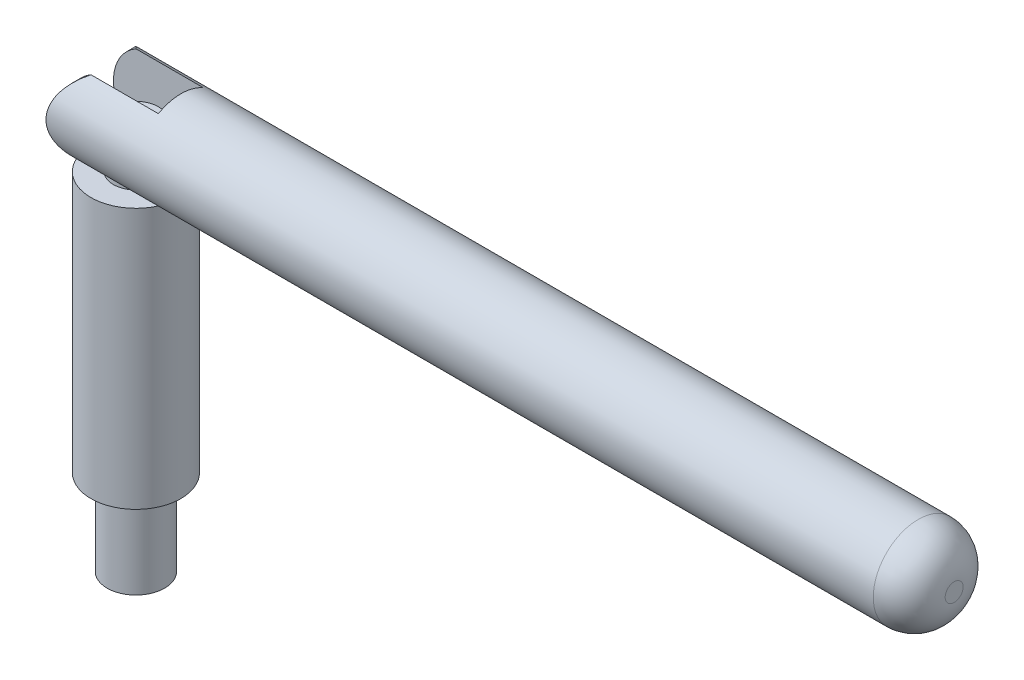
ISO-10303-21;
HEADER;
FILE_DESCRIPTION(('STEP AP214'),'2;1');
FILE_NAME('part.step','',(''),(''),'','','');
FILE_SCHEMA(('AUTOMOTIVE_DESIGN { 1 0 10303 214 1 1 1 1 }'));
ENDSEC;
DATA;
#1=APPLICATION_CONTEXT('core data for automotive mechanical design processes');
#2=APPLICATION_PROTOCOL_DEFINITION('international standard','automotive_design',2000,#1);
#3=PRODUCT_CONTEXT('',#1,'mechanical');
#4=PRODUCT('Part','Part','',(#3));
#5=PRODUCT_RELATED_PRODUCT_CATEGORY('part','',(#4));
#6=PRODUCT_DEFINITION_FORMATION('','',#4);
#7=PRODUCT_DEFINITION_CONTEXT('part definition',#1,'design');
#8=PRODUCT_DEFINITION('design','',#6,#7);
#9=PRODUCT_DEFINITION_SHAPE('','',#8);
#10=(LENGTH_UNIT() NAMED_UNIT(*) SI_UNIT(.MILLI.,.METRE.));
#11=(NAMED_UNIT(*) PLANE_ANGLE_UNIT() SI_UNIT($,.RADIAN.));
#12=(NAMED_UNIT(*) SI_UNIT($,.STERADIAN.) SOLID_ANGLE_UNIT());
#13=UNCERTAINTY_MEASURE_WITH_UNIT(LENGTH_MEASURE(1.E-05),#10,'distance_accuracy_value','');
#14=(GEOMETRIC_REPRESENTATION_CONTEXT(3) GLOBAL_UNCERTAINTY_ASSIGNED_CONTEXT((#13)) GLOBAL_UNIT_ASSIGNED_CONTEXT((#10,
#11,#12)) REPRESENTATION_CONTEXT('',''));
#15=CARTESIAN_POINT('',(0.,0.,0.));
#16=DIRECTION('',(0.,0.,1.));
#17=DIRECTION('',(1.,0.,0.));
#18=AXIS2_PLACEMENT_3D('',#15,#16,#17);
#19=CARTESIAN_POINT('',(-5.,34.,0.));
#20=DIRECTION('',(1.,0.,0.));
#21=DIRECTION('',(0.,0.,-1.));
#22=AXIS2_PLACEMENT_3D('',#19,#20,#21);
#23=CYLINDRICAL_SURFACE('',#22,5.);
#24=CARTESIAN_POINT('',(87.,34.,0.));
#25=DIRECTION('',(1.,0.,0.));
#26=DIRECTION('',(0.,0.,-1.));
#27=AXIS2_PLACEMENT_3D('',#24,#25,#26);
#28=CIRCLE('',#27,5.);
#29=CARTESIAN_POINT('',(87.,34.,-5.));
#30=VERTEX_POINT('',#29);
#31=EDGE_CURVE('E110',#30,#30,#28,.F.);
#32=ORIENTED_EDGE('',*,*,#31,.T.);
#33=EDGE_LOOP('',(#32));
#34=FACE_BOUND('',#33,.T.);
#35=DIRECTION('',(1.,0.,0.));
#36=VECTOR('',#35,1.);
#37=CARTESIAN_POINT('',(-5.,38.3301270189222,2.5));
#38=LINE('',#37,#36);
#39=CARTESIAN_POINT('',(5.,38.3301270189222,2.5));
#40=VERTEX_POINT('',#39);
#41=CARTESIAN_POINT('',(-2.5,38.3301270189222,2.5));
#42=VERTEX_POINT('',#41);
#43=EDGE_CURVE('E105',#40,#42,#38,.F.);
#44=ORIENTED_EDGE('',*,*,#43,.T.);
#45=CARTESIAN_POINT('',(0.,34.,0.));
#46=DIRECTION('',(0.707106781186547,0.,0.707106781186547));
#47=DIRECTION('',(0.707106781186547,0.,-0.707106781186547));
#48=AXIS2_PLACEMENT_3D('',#45,#46,#47);
#49=ELLIPSE('',#48,7.07106781186548,5.);
#50=CARTESIAN_POINT('',(-2.5,29.6698729810778,2.5));
#51=VERTEX_POINT('',#50);
#52=EDGE_CURVE('E120',#42,#51,#49,.T.);
#53=ORIENTED_EDGE('',*,*,#52,.T.);
#54=DIRECTION('',(1.,0.,0.));
#55=VECTOR('',#54,1.);
#56=CARTESIAN_POINT('',(-5.,29.6698729810778,2.5));
#57=LINE('',#56,#55);
#58=CARTESIAN_POINT('',(5.,29.6698729810778,2.5));
#59=VERTEX_POINT('',#58);
#60=EDGE_CURVE('E64',#51,#59,#57,.T.);
#61=ORIENTED_EDGE('',*,*,#60,.T.);
#62=CARTESIAN_POINT('',(5.,34.,0.));
#63=DIRECTION('',(-1.,0.,0.));
#64=DIRECTION('',(0.,0.,1.));
#65=AXIS2_PLACEMENT_3D('',#62,#63,#64);
#66=CIRCLE('',#65,5.);
#67=CARTESIAN_POINT('',(5.,29.6698729810778,-2.5));
#68=VERTEX_POINT('',#67);
#69=EDGE_CURVE('E112',#59,#68,#66,.F.);
#70=ORIENTED_EDGE('',*,*,#69,.T.);
#71=DIRECTION('',(1.,0.,0.));
#72=VECTOR('',#71,1.);
#73=CARTESIAN_POINT('',(-5.,29.6698729810778,-2.5));
#74=LINE('',#73,#72);
#75=CARTESIAN_POINT('',(-2.5,29.6698729810778,-2.5));
#76=VERTEX_POINT('',#75);
#77=EDGE_CURVE('E88',#68,#76,#74,.F.);
#78=ORIENTED_EDGE('',*,*,#77,.T.);
#79=CARTESIAN_POINT('',(0.,34.,0.));
#80=DIRECTION('',(0.707106781186547,0.,-0.707106781186547));
#81=DIRECTION('',(0.707106781186547,0.,0.707106781186547));
#82=AXIS2_PLACEMENT_3D('',#79,#80,#81);
#83=ELLIPSE('',#82,7.07106781186548,5.);
#84=CARTESIAN_POINT('',(-2.5,38.3301270189222,-2.5));
#85=VERTEX_POINT('',#84);
#86=EDGE_CURVE('E57',#76,#85,#83,.T.);
#87=ORIENTED_EDGE('',*,*,#86,.T.);
#88=DIRECTION('',(1.,0.,0.));
#89=VECTOR('',#88,1.);
#90=CARTESIAN_POINT('',(-5.,38.3301270189222,-2.5));
#91=LINE('',#90,#89);
#92=CARTESIAN_POINT('',(5.,38.3301270189222,-2.5));
#93=VERTEX_POINT('',#92);
#94=EDGE_CURVE('E86',#85,#93,#91,.T.);
#95=ORIENTED_EDGE('',*,*,#94,.T.);
#96=EDGE_CURVE('E51',#93,#40,#66,.F.);
#97=ORIENTED_EDGE('',*,*,#96,.T.);
#98=EDGE_LOOP('',(#44,#53,#61,#70,#78,#87,#95,#97));
#99=FACE_BOUND('',#98,.T.);
#100=ADVANCED_FACE('F43',(#34,#99),#23,.T.);
#101=CARTESIAN_POINT('',(5.,39.,2.5));
#102=DIRECTION('',(0.,0.,-1.));
#103=DIRECTION('',(-1.,0.,0.));
#104=AXIS2_PLACEMENT_3D('',#101,#102,#103);
#105=PLANE('',#104);
#106=CARTESIAN_POINT('',(0.,34.,2.5));
#107=DIRECTION('',(0.,0.,-1.));
#108=DIRECTION('',(-1.,0.,0.));
#109=AXIS2_PLACEMENT_3D('',#106,#107,#108);
#110=CIRCLE('',#109,5.);
#111=EDGE_CURVE('E89',#51,#42,#110,.T.);
#112=ORIENTED_EDGE('',*,*,#111,.T.);
#113=ORIENTED_EDGE('',*,*,#43,.F.);
#114=DIRECTION('',(0.,-1.,0.));
#115=VECTOR('',#114,1.);
#116=CARTESIAN_POINT('',(5.,39.,2.5));
#117=LINE('',#116,#115);
#118=EDGE_CURVE('E97',#40,#59,#117,.T.);
#119=ORIENTED_EDGE('',*,*,#118,.T.);
#120=ORIENTED_EDGE('',*,*,#60,.F.);
#121=EDGE_LOOP('',(#112,#113,#119,#120));
#122=FACE_BOUND('',#121,.T.);
#123=ADVANCED_FACE('F117',(#122),#105,.T.);
#124=CARTESIAN_POINT('',(5.,39.,-2.5));
#125=DIRECTION('',(0.,0.,1.));
#126=DIRECTION('',(1.,0.,0.));
#127=AXIS2_PLACEMENT_3D('',#124,#125,#126);
#128=PLANE('',#127);
#129=ORIENTED_EDGE('',*,*,#94,.F.);
#130=CARTESIAN_POINT('',(0.,34.,-2.5));
#131=DIRECTION('',(0.,0.,1.));
#132=DIRECTION('',(1.,0.,0.));
#133=AXIS2_PLACEMENT_3D('',#130,#131,#132);
#134=CIRCLE('',#133,5.);
#135=EDGE_CURVE('E13',#85,#76,#134,.T.);
#136=ORIENTED_EDGE('',*,*,#135,.T.);
#137=ORIENTED_EDGE('',*,*,#77,.F.);
#138=DIRECTION('',(0.,-1.,0.));
#139=VECTOR('',#138,1.);
#140=CARTESIAN_POINT('',(5.,39.,-2.5));
#141=LINE('',#140,#139);
#142=EDGE_CURVE('E96',#93,#68,#141,.T.);
#143=ORIENTED_EDGE('',*,*,#142,.F.);
#144=EDGE_LOOP('',(#129,#136,#137,#143));
#145=FACE_BOUND('',#144,.T.);
#146=ADVANCED_FACE('F94',(#145),#128,.T.);
#147=CARTESIAN_POINT('',(91.,34.,0.));
#148=DIRECTION('',(1.,0.,0.));
#149=DIRECTION('',(0.,0.,-1.));
#150=AXIS2_PLACEMENT_3D('',#147,#148,#149);
#151=PLANE('',#150);
#152=CARTESIAN_POINT('',(91.,34.,0.));
#153=DIRECTION('',(1.,0.,0.));
#154=DIRECTION('',(0.,0.,-1.));
#155=AXIS2_PLACEMENT_3D('',#152,#153,#154);
#156=CIRCLE('',#155,1.);
#157=CARTESIAN_POINT('',(91.,34.,-1.));
#158=VERTEX_POINT('',#157);
#159=EDGE_CURVE('E107',#158,#158,#156,.T.);
#160=ORIENTED_EDGE('',*,*,#159,.T.);
#161=EDGE_LOOP('',(#160));
#162=FACE_BOUND('',#161,.T.);
#163=ADVANCED_FACE('F137',(#162),#151,.T.);
#164=CARTESIAN_POINT('',(87.,34.,0.));
#165=DIRECTION('',(1.,0.,0.));
#166=DIRECTION('',(0.,0.,-1.));
#167=AXIS2_PLACEMENT_3D('',#164,#165,#166);
#168=DEGENERATE_TOROIDAL_SURFACE('',#167,1.,4.,.T.);
#169=ORIENTED_EDGE('',*,*,#31,.F.);
#170=EDGE_LOOP('',(#169));
#171=FACE_BOUND('',#170,.T.);
#172=ORIENTED_EDGE('',*,*,#159,.F.);
#173=EDGE_LOOP('',(#172));
#174=FACE_BOUND('',#173,.T.);
#175=ADVANCED_FACE('F45',(#171,#174),#168,.T.);
#176=CARTESIAN_POINT('',(5.,39.,-2.5));
#177=DIRECTION('',(-1.,0.,0.));
#178=DIRECTION('',(0.,0.,1.));
#179=AXIS2_PLACEMENT_3D('',#176,#177,#178);
#180=PLANE('',#179);
#181=ORIENTED_EDGE('',*,*,#118,.F.);
#182=ORIENTED_EDGE('',*,*,#96,.F.);
#183=ORIENTED_EDGE('',*,*,#142,.T.);
#184=ORIENTED_EDGE('',*,*,#69,.F.);
#185=EDGE_LOOP('',(#181,#182,#183,#184));
#186=FACE_BOUND('',#185,.T.);
#187=ADVANCED_FACE('F115',(#186),#180,.T.);
#188=CARTESIAN_POINT('',(0.,34.,-5.));
#189=DIRECTION('',(0.,0.,1.));
#190=DIRECTION('',(1.,0.,0.));
#191=AXIS2_PLACEMENT_3D('',#188,#189,#190);
#192=CYLINDRICAL_SURFACE('',#191,5.);
#193=ORIENTED_EDGE('',*,*,#135,.F.);
#194=ORIENTED_EDGE('',*,*,#86,.F.);
#195=EDGE_LOOP('',(#193,#194));
#196=FACE_BOUND('',#195,.T.);
#197=ADVANCED_FACE('F91',(#196),#192,.T.);
#198=ORIENTED_EDGE('',*,*,#52,.F.);
#199=ORIENTED_EDGE('',*,*,#111,.F.);
#200=EDGE_LOOP('',(#198,#199));
#201=FACE_BOUND('',#200,.T.);
#202=ADVANCED_FACE('F122',(#201),#192,.T.);
#203=CLOSED_SHELL('',(#100,#123,#146,#163,#175,#187,#197,#202));
#204=MANIFOLD_SOLID_BREP('B2',#203);
#205=CARTESIAN_POINT('',(0.,0.,0.));
#206=DIRECTION('',(0.,1.,0.));
#207=DIRECTION('',(0.,0.,1.));
#208=AXIS2_PLACEMENT_3D('',#205,#206,#207);
#209=PLANE('',#208);
#210=CARTESIAN_POINT('',(0.,0.,0.));
#211=DIRECTION('',(0.,1.,0.));
#212=DIRECTION('',(0.,0.,1.));
#213=AXIS2_PLACEMENT_3D('',#210,#211,#212);
#214=CIRCLE('',#213,5.);
#215=CARTESIAN_POINT('',(0.,0.,-5.));
#216=VERTEX_POINT('',#215);
#217=EDGE_CURVE('E211',#216,#216,#214,.T.);
#218=ORIENTED_EDGE('',*,*,#217,.F.);
#219=EDGE_LOOP('',(#218));
#220=FACE_BOUND('',#219,.T.);
#221=CARTESIAN_POINT('',(0.,0.,0.));
#222=DIRECTION('',(0.,1.,0.));
#223=DIRECTION('',(0.,0.,1.));
#224=AXIS2_PLACEMENT_3D('',#221,#222,#223);
#225=CIRCLE('',#224,3.2);
#226=CARTESIAN_POINT('',(0.,0.,3.2));
#227=VERTEX_POINT('',#226);
#228=EDGE_CURVE('E42',#227,#227,#225,.F.);
#229=ORIENTED_EDGE('',*,*,#228,.F.);
#230=EDGE_LOOP('',(#229));
#231=FACE_BOUND('',#230,.T.);
#232=ADVANCED_FACE('F200',(#220,#231),#209,.F.);
#233=CARTESIAN_POINT('',(0.,29.,0.));
#234=DIRECTION('',(0.,1.,0.));
#235=DIRECTION('',(0.,0.,1.));
#236=AXIS2_PLACEMENT_3D('',#233,#234,#235);
#237=PLANE('',#236);
#238=CARTESIAN_POINT('',(0.,29.,0.));
#239=DIRECTION('',(0.,1.,0.));
#240=DIRECTION('',(0.,0.,1.));
#241=AXIS2_PLACEMENT_3D('',#238,#239,#240);
#242=CIRCLE('',#241,5.);
#243=CARTESIAN_POINT('',(0.,29.,-5.));
#244=VERTEX_POINT('',#243);
#245=EDGE_CURVE('E207',#244,#244,#242,.T.);
#246=ORIENTED_EDGE('',*,*,#245,.T.);
#247=EDGE_LOOP('',(#246));
#248=FACE_BOUND('',#247,.T.);
#249=CARTESIAN_POINT('',(0.,29.,0.));
#250=DIRECTION('',(0.,1.,0.));
#251=DIRECTION('',(0.,0.,1.));
#252=AXIS2_PLACEMENT_3D('',#249,#250,#251);
#253=CIRCLE('',#252,2.5);
#254=CARTESIAN_POINT('',(0.,29.,2.5));
#255=VERTEX_POINT('',#254);
#256=EDGE_CURVE('E218',#255,#255,#253,.T.);
#257=ORIENTED_EDGE('',*,*,#256,.F.);
#258=EDGE_LOOP('',(#257));
#259=FACE_BOUND('',#258,.T.);
#260=ADVANCED_FACE('F242',(#248,#259),#237,.T.);
#261=CARTESIAN_POINT('',(0.,29.,0.));
#262=DIRECTION('',(0.,-1.,0.));
#263=DIRECTION('',(0.,0.,-1.));
#264=AXIS2_PLACEMENT_3D('',#261,#262,#263);
#265=CYLINDRICAL_SURFACE('',#264,5.);
#266=CARTESIAN_POINT('',(0.,29.,-5.));
#267=CARTESIAN_POINT('',(0.,28.6979166666667,-5.));
#268=CARTESIAN_POINT('',(0.,28.3958333333333,-5.));
#269=CARTESIAN_POINT('',(0.,27.7916666666667,-5.));
#270=CARTESIAN_POINT('',(0.,27.4895833333333,-5.));
#271=CARTESIAN_POINT('',(0.,26.8854166666667,-5.));
#272=CARTESIAN_POINT('',(0.,26.5833333333333,-5.));
#273=CARTESIAN_POINT('',(0.,25.9791666666667,-5.));
#274=CARTESIAN_POINT('',(0.,25.6770833333333,-5.));
#275=CARTESIAN_POINT('',(0.,25.0729166666667,-5.));
#276=CARTESIAN_POINT('',(0.,24.7708333333333,-5.));
#277=CARTESIAN_POINT('',(0.,24.1666666666667,-5.));
#278=CARTESIAN_POINT('',(0.,23.8645833333333,-5.));
#279=CARTESIAN_POINT('',(0.,23.2604166666667,-5.));
#280=CARTESIAN_POINT('',(0.,22.9583333333333,-5.));
#281=CARTESIAN_POINT('',(0.,22.3541666666667,-5.));
#282=CARTESIAN_POINT('',(0.,22.0520833333333,-5.));
#283=CARTESIAN_POINT('',(0.,21.4479166666667,-5.));
#284=CARTESIAN_POINT('',(0.,21.1458333333333,-5.));
#285=CARTESIAN_POINT('',(0.,20.5416666666667,-5.));
#286=CARTESIAN_POINT('',(0.,20.2395833333333,-5.));
#287=CARTESIAN_POINT('',(0.,19.6354166666667,-5.));
#288=CARTESIAN_POINT('',(0.,19.3333333333333,-5.));
#289=CARTESIAN_POINT('',(0.,18.7291666666667,-5.));
#290=CARTESIAN_POINT('',(0.,18.4270833333333,-5.));
#291=CARTESIAN_POINT('',(0.,17.8229166666667,-5.));
#292=CARTESIAN_POINT('',(0.,17.5208333333333,-5.));
#293=CARTESIAN_POINT('',(0.,16.9166666666667,-5.));
#294=CARTESIAN_POINT('',(0.,16.6145833333333,-5.));
#295=CARTESIAN_POINT('',(0.,16.0104166666667,-5.));
#296=CARTESIAN_POINT('',(0.,15.7083333333333,-5.));
#297=CARTESIAN_POINT('',(0.,15.1041666666667,-5.));
#298=CARTESIAN_POINT('',(0.,14.8020833333333,-5.));
#299=CARTESIAN_POINT('',(0.,14.1979166666667,-5.));
#300=CARTESIAN_POINT('',(0.,13.8958333333333,-5.));
#301=CARTESIAN_POINT('',(0.,13.2916666666667,-5.));
#302=CARTESIAN_POINT('',(0.,12.9895833333333,-5.));
#303=CARTESIAN_POINT('',(0.,12.3854166666667,-5.));
#304=CARTESIAN_POINT('',(0.,12.0833333333333,-5.));
#305=CARTESIAN_POINT('',(0.,11.4791666666667,-5.));
#306=CARTESIAN_POINT('',(0.,11.1770833333333,-5.));
#307=CARTESIAN_POINT('',(0.,10.5729166666667,-5.));
#308=CARTESIAN_POINT('',(0.,10.2708333333333,-5.));
#309=CARTESIAN_POINT('',(0.,9.66666666666667,-5.));
#310=CARTESIAN_POINT('',(0.,9.36458333333333,-5.));
#311=CARTESIAN_POINT('',(0.,8.76041666666667,-5.));
#312=CARTESIAN_POINT('',(0.,8.45833333333333,-5.));
#313=CARTESIAN_POINT('',(0.,7.85416666666667,-5.));
#314=CARTESIAN_POINT('',(0.,7.55208333333333,-5.));
#315=CARTESIAN_POINT('',(0.,6.94791666666667,-5.));
#316=CARTESIAN_POINT('',(0.,6.64583333333333,-5.));
#317=CARTESIAN_POINT('',(0.,6.04166666666667,-5.));
#318=CARTESIAN_POINT('',(0.,5.73958333333333,-5.));
#319=CARTESIAN_POINT('',(0.,5.13541666666667,-5.));
#320=CARTESIAN_POINT('',(0.,4.83333333333333,-5.));
#321=CARTESIAN_POINT('',(0.,4.22916666666667,-5.));
#322=CARTESIAN_POINT('',(0.,3.92708333333333,-5.));
#323=CARTESIAN_POINT('',(0.,3.32291666666667,-5.));
#324=CARTESIAN_POINT('',(0.,3.02083333333333,-5.));
#325=CARTESIAN_POINT('',(0.,2.41666666666667,-5.));
#326=CARTESIAN_POINT('',(0.,2.11458333333333,-5.));
#327=CARTESIAN_POINT('',(0.,1.51041666666667,-5.));
#328=CARTESIAN_POINT('',(0.,1.20833333333333,-5.));
#329=CARTESIAN_POINT('',(0.,0.604166666666667,-5.));
#330=CARTESIAN_POINT('',(0.,0.302083333333333,-5.));
#331=CARTESIAN_POINT('',(0.,0.,-5.));
#332=B_SPLINE_CURVE_WITH_KNOTS('',3,(#266,#267,#268,#269,#270,#271,#272,#273,#274,#275,#276,
#277,#278,#279,#280,#281,#282,#283,#284,#285,#286,#287,#288,#289,#290,#291,#292,#293,#294,#295,
#296,#297,#298,#299,#300,#301,#302,#303,#304,#305,#306,#307,#308,#309,#310,#311,#312,#313,#314,
#315,#316,#317,#318,#319,#320,#321,#322,#323,#324,#325,#326,#327,#328,#329,#330,#331),
.UNSPECIFIED.,.F.,.F.,(4,2,2,2,2,2,2,2,2,2,2,2,2,2,2,2,2,2,2,2,2,2,2,2,2,2,2,2,2,2,2,2,4),(0.,
0.906249999999997,1.8125,2.71875,3.625,4.53125,5.4375,6.34375,7.25,8.15625,9.0625,9.96875,
10.875,11.78125,12.6875,13.59375,14.5,15.40625,16.3125,17.21875,18.125,19.03125,19.9375,
20.84375,21.75,22.65625,23.5625,24.46875,25.375,26.28125,27.1875,28.09375,29.),.UNSPECIFIED.);
#333=EDGE_CURVE('BSEAM202',#244,#216,#332,.T.);
#334=ORIENTED_EDGE('',*,*,#245,.F.);
#335=ORIENTED_EDGE('',*,*,#217,.T.);
#336=ORIENTED_EDGE('',*,*,#333,.T.);
#337=ORIENTED_EDGE('',*,*,#333,.F.);
#338=EDGE_LOOP('',(#334,#336,#335,#337));
#339=FACE_BOUND('',#338,.T.);
#340=ADVANCED_FACE('F202',(#339),#265,.T.);
#341=CARTESIAN_POINT('',(0.,34.,0.));
#342=DIRECTION('',(0.,-1.,0.));
#343=DIRECTION('',(0.,0.,-1.));
#344=AXIS2_PLACEMENT_3D('',#341,#342,#343);
#345=CYLINDRICAL_SURFACE('',#344,2.5);
#346=CARTESIAN_POINT('',(0.,34.,0.));
#347=DIRECTION('',(0.,1.,0.));
#348=DIRECTION('',(0.,0.,1.));
#349=AXIS2_PLACEMENT_3D('',#346,#347,#348);
#350=CIRCLE('',#349,2.5);
#351=CARTESIAN_POINT('',(0.,34.,2.5));
#352=VERTEX_POINT('',#351);
#353=EDGE_CURVE('E216',#352,#352,#350,.T.);
#354=ORIENTED_EDGE('',*,*,#353,.F.);
#355=EDGE_LOOP('',(#354));
#356=FACE_BOUND('',#355,.T.);
#357=ORIENTED_EDGE('',*,*,#256,.T.);
#358=EDGE_LOOP('',(#357));
#359=FACE_BOUND('',#358,.T.);
#360=ADVANCED_FACE('F238',(#356,#359),#345,.T.);
#361=CARTESIAN_POINT('',(0.,34.,0.));
#362=DIRECTION('',(0.,1.,0.));
#363=DIRECTION('',(0.,0.,1.));
#364=AXIS2_PLACEMENT_3D('',#361,#362,#363);
#365=PLANE('',#364);
#366=ORIENTED_EDGE('',*,*,#353,.T.);
#367=EDGE_LOOP('',(#366));
#368=FACE_BOUND('',#367,.T.);
#369=ADVANCED_FACE('F231',(#368),#365,.T.);
#370=CARTESIAN_POINT('',(0.,-9.525,0.));
#371=DIRECTION('',(0.,1.,0.));
#372=DIRECTION('',(0.,0.,1.));
#373=AXIS2_PLACEMENT_3D('',#370,#371,#372);
#374=CYLINDRICAL_SURFACE('',#373,3.2);
#375=CARTESIAN_POINT('',(0.,-9.525,0.));
#376=DIRECTION('',(0.,-1.,0.));
#377=DIRECTION('',(0.,0.,-1.));
#378=AXIS2_PLACEMENT_3D('',#375,#376,#377);
#379=CIRCLE('',#378,3.2);
#380=CARTESIAN_POINT('',(0.,-9.525,3.2));
#381=VERTEX_POINT('',#380);
#382=EDGE_CURVE('E221',#381,#381,#379,.T.);
#383=CARTESIAN_POINT('',(0.,-9.525,3.2));
#384=CARTESIAN_POINT('',(0.,-9.42578125,3.2));
#385=CARTESIAN_POINT('',(0.,-9.3265625,3.2));
#386=CARTESIAN_POINT('',(0.,-9.128125,3.2));
#387=CARTESIAN_POINT('',(0.,-9.02890625,3.2));
#388=CARTESIAN_POINT('',(0.,-8.83046875,3.2));
#389=CARTESIAN_POINT('',(0.,-8.73125,3.2));
#390=CARTESIAN_POINT('',(0.,-8.5328125,3.2));
#391=CARTESIAN_POINT('',(0.,-8.43359375,3.2));
#392=CARTESIAN_POINT('',(0.,-8.23515625,3.2));
#393=CARTESIAN_POINT('',(0.,-8.1359375,3.2));
#394=CARTESIAN_POINT('',(0.,-7.9375,3.2));
#395=CARTESIAN_POINT('',(0.,-7.83828125,3.2));
#396=CARTESIAN_POINT('',(0.,-7.63984375,3.2));
#397=CARTESIAN_POINT('',(0.,-7.540625,3.2));
#398=CARTESIAN_POINT('',(0.,-7.3421875,3.2));
#399=CARTESIAN_POINT('',(0.,-7.24296875,3.2));
#400=CARTESIAN_POINT('',(0.,-7.04453125,3.2));
#401=CARTESIAN_POINT('',(0.,-6.9453125,3.2));
#402=CARTESIAN_POINT('',(0.,-6.746875,3.2));
#403=CARTESIAN_POINT('',(0.,-6.64765625,3.2));
#404=CARTESIAN_POINT('',(0.,-6.44921875,3.2));
#405=CARTESIAN_POINT('',(0.,-6.35,3.2));
#406=CARTESIAN_POINT('',(0.,-6.1515625,3.2));
#407=CARTESIAN_POINT('',(0.,-6.05234375,3.2));
#408=CARTESIAN_POINT('',(0.,-5.85390625,3.2));
#409=CARTESIAN_POINT('',(0.,-5.7546875,3.2));
#410=CARTESIAN_POINT('',(0.,-5.55625,3.2));
#411=CARTESIAN_POINT('',(0.,-5.45703125,3.2));
#412=CARTESIAN_POINT('',(0.,-5.25859375,3.2));
#413=CARTESIAN_POINT('',(0.,-5.159375,3.2));
#414=CARTESIAN_POINT('',(0.,-4.9609375,3.2));
#415=CARTESIAN_POINT('',(0.,-4.86171875,3.2));
#416=CARTESIAN_POINT('',(0.,-4.66328125,3.2));
#417=CARTESIAN_POINT('',(0.,-4.5640625,3.2));
#418=CARTESIAN_POINT('',(0.,-4.365625,3.2));
#419=CARTESIAN_POINT('',(0.,-4.26640625,3.2));
#420=CARTESIAN_POINT('',(0.,-4.06796875,3.2));
#421=CARTESIAN_POINT('',(0.,-3.96875,3.2));
#422=CARTESIAN_POINT('',(0.,-3.7703125,3.2));
#423=CARTESIAN_POINT('',(0.,-3.67109375,3.2));
#424=CARTESIAN_POINT('',(0.,-3.47265625,3.2));
#425=CARTESIAN_POINT('',(0.,-3.3734375,3.2));
#426=CARTESIAN_POINT('',(0.,-3.175,3.2));
#427=CARTESIAN_POINT('',(0.,-3.07578125,3.2));
#428=CARTESIAN_POINT('',(0.,-2.87734375,3.2));
#429=CARTESIAN_POINT('',(0.,-2.778125,3.2));
#430=CARTESIAN_POINT('',(0.,-2.5796875,3.2));
#431=CARTESIAN_POINT('',(0.,-2.48046875,3.2));
#432=CARTESIAN_POINT('',(0.,-2.28203125,3.2));
#433=CARTESIAN_POINT('',(0.,-2.1828125,3.2));
#434=CARTESIAN_POINT('',(0.,-1.984375,3.2));
#435=CARTESIAN_POINT('',(0.,-1.88515625,3.2));
#436=CARTESIAN_POINT('',(0.,-1.68671875,3.2));
#437=CARTESIAN_POINT('',(0.,-1.5875,3.2));
#438=CARTESIAN_POINT('',(0.,-1.3890625,3.2));
#439=CARTESIAN_POINT('',(0.,-1.28984375,3.2));
#440=CARTESIAN_POINT('',(0.,-1.09140625,3.2));
#441=CARTESIAN_POINT('',(0.,-0.992187500000001,3.2));
#442=CARTESIAN_POINT('',(0.,-0.793750000000001,3.2));
#443=CARTESIAN_POINT('',(0.,-0.69453125,3.2));
#444=CARTESIAN_POINT('',(0.,-0.49609375,3.2));
#445=CARTESIAN_POINT('',(0.,-0.396875,3.2));
#446=CARTESIAN_POINT('',(0.,-0.1984375,3.2));
#447=CARTESIAN_POINT('',(0.,-0.0992187500000001,3.2));
#448=CARTESIAN_POINT('',(0.,0.,3.2));
#449=B_SPLINE_CURVE_WITH_KNOTS('',3,(#383,#384,#385,#386,#387,#388,#389,#390,#391,#392,#393,
#394,#395,#396,#397,#398,#399,#400,#401,#402,#403,#404,#405,#406,#407,#408,#409,#410,#411,#412,
#413,#414,#415,#416,#417,#418,#419,#420,#421,#422,#423,#424,#425,#426,#427,#428,#429,#430,#431,
#432,#433,#434,#435,#436,#437,#438,#439,#440,#441,#442,#443,#444,#445,#446,#447,#448),
.UNSPECIFIED.,.F.,.F.,(4,2,2,2,2,2,2,2,2,2,2,2,2,2,2,2,2,2,2,2,2,2,2,2,2,2,2,2,2,2,2,2,4),(0.,
0.297656249999998,0.595312499999999,0.892968749999999,1.190625,1.48828125,1.7859375,2.08359375,
2.38125,2.67890625,2.9765625,3.27421875,3.571875,3.86953125,4.1671875,4.46484375,4.7625,
5.06015625,5.3578125,5.65546875,5.953125,6.25078125,6.5484375,6.84609375,7.14375,7.44140625,
7.7390625,8.03671875,8.334375,8.63203125,8.9296875,9.22734375,9.525),.UNSPECIFIED.);
#450=EDGE_CURVE('BSEAM229',#381,#227,#449,.T.);
#451=ORIENTED_EDGE('',*,*,#382,.F.);
#452=ORIENTED_EDGE('',*,*,#228,.T.);
#453=ORIENTED_EDGE('',*,*,#450,.T.);
#454=ORIENTED_EDGE('',*,*,#450,.F.);
#455=EDGE_LOOP('',(#451,#453,#452,#454));
#456=FACE_BOUND('',#455,.T.);
#457=ADVANCED_FACE('F229',(#456),#374,.T.);
#458=CARTESIAN_POINT('',(0.,-9.525,0.));
#459=DIRECTION('',(0.,-1.,0.));
#460=DIRECTION('',(0.,0.,-1.));
#461=AXIS2_PLACEMENT_3D('',#458,#459,#460);
#462=PLANE('',#461);
#463=ORIENTED_EDGE('',*,*,#382,.T.);
#464=EDGE_LOOP('',(#463));
#465=FACE_BOUND('',#464,.T.);
#466=ADVANCED_FACE('F227',(#465),#462,.T.);
#467=CLOSED_SHELL('',(#232,#260,#340,#360,#369,#457,#466));
#468=MANIFOLD_SOLID_BREP('B7',#467);
#469=ADVANCED_BREP_SHAPE_REPRESENTATION('',(#18,#204,#468),#14);
#470=SHAPE_DEFINITION_REPRESENTATION(#9,#469);
ENDSEC;
END-ISO-10303-21;
